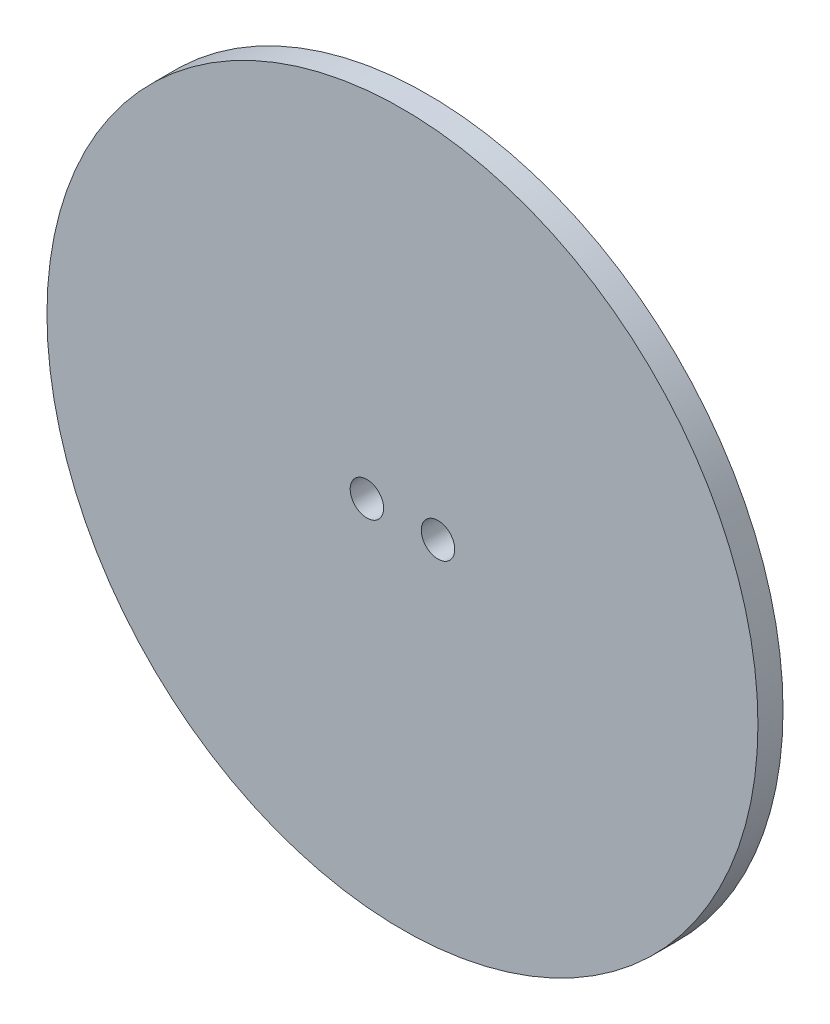
ISO-10303-21;
HEADER;
FILE_DESCRIPTION(('STEP AP214'),'2;1');
FILE_NAME('part.step','',(''),(''),'','','');
FILE_SCHEMA(('AUTOMOTIVE_DESIGN { 1 0 10303 214 1 1 1 1 }'));
ENDSEC;
DATA;
#1=APPLICATION_CONTEXT('core data for automotive mechanical design processes');
#2=APPLICATION_PROTOCOL_DEFINITION('international standard','automotive_design',2000,#1);
#3=PRODUCT_CONTEXT('',#1,'mechanical');
#4=PRODUCT('Part','Part','',(#3));
#5=PRODUCT_RELATED_PRODUCT_CATEGORY('part','',(#4));
#6=PRODUCT_DEFINITION_FORMATION('','',#4);
#7=PRODUCT_DEFINITION_CONTEXT('part definition',#1,'design');
#8=PRODUCT_DEFINITION('design','',#6,#7);
#9=PRODUCT_DEFINITION_SHAPE('','',#8);
#10=(LENGTH_UNIT() NAMED_UNIT(*) SI_UNIT(.MILLI.,.METRE.));
#11=(NAMED_UNIT(*) PLANE_ANGLE_UNIT() SI_UNIT($,.RADIAN.));
#12=(NAMED_UNIT(*) SI_UNIT($,.STERADIAN.) SOLID_ANGLE_UNIT());
#13=UNCERTAINTY_MEASURE_WITH_UNIT(LENGTH_MEASURE(1.E-05),#10,'distance_accuracy_value','');
#14=(GEOMETRIC_REPRESENTATION_CONTEXT(3) GLOBAL_UNCERTAINTY_ASSIGNED_CONTEXT((#13)) GLOBAL_UNIT_ASSIGNED_CONTEXT((#10,
#11,#12)) REPRESENTATION_CONTEXT('',''));
#15=CARTESIAN_POINT('',(0.,0.,0.));
#16=DIRECTION('',(0.,0.,1.));
#17=DIRECTION('',(1.,0.,0.));
#18=AXIS2_PLACEMENT_3D('',#15,#16,#17);
#19=CARTESIAN_POINT('',(0.,0.,3.));
#20=DIRECTION('',(0.,0.,-1.));
#21=DIRECTION('',(-1.,0.,0.));
#22=AXIS2_PLACEMENT_3D('',#19,#20,#21);
#23=CYLINDRICAL_SURFACE('',#22,42.5);
#24=CARTESIAN_POINT('',(0.,0.,3.));
#25=DIRECTION('',(0.,0.,1.));
#26=DIRECTION('',(1.,0.,0.));
#27=AXIS2_PLACEMENT_3D('',#24,#25,#26);
#28=CIRCLE('',#27,42.5);
#29=CARTESIAN_POINT('',(42.5,0.,3.));
#30=VERTEX_POINT('',#29);
#31=EDGE_CURVE('E10',#30,#30,#28,.T.);
#32=ORIENTED_EDGE('',*,*,#31,.F.);
#33=EDGE_LOOP('',(#32));
#34=FACE_BOUND('',#33,.T.);
#35=CARTESIAN_POINT('',(0.,0.,0.));
#36=DIRECTION('',(0.,0.,1.));
#37=DIRECTION('',(1.,0.,0.));
#38=AXIS2_PLACEMENT_3D('',#35,#36,#37);
#39=CIRCLE('',#38,42.5);
#40=CARTESIAN_POINT('',(42.5,0.,0.));
#41=VERTEX_POINT('',#40);
#42=EDGE_CURVE('E35',#41,#41,#39,.T.);
#43=ORIENTED_EDGE('',*,*,#42,.T.);
#44=EDGE_LOOP('',(#43));
#45=FACE_BOUND('',#44,.T.);
#46=ADVANCED_FACE('F32',(#34,#45),#23,.T.);
#47=CARTESIAN_POINT('',(0.,0.,3.));
#48=DIRECTION('',(0.,0.,1.));
#49=DIRECTION('',(1.,0.,0.));
#50=AXIS2_PLACEMENT_3D('',#47,#48,#49);
#51=PLANE('',#50);
#52=CARTESIAN_POINT('',(-4.25000000000001,0.,3.));
#53=DIRECTION('',(0.,0.,1.));
#54=DIRECTION('',(1.,0.,0.));
#55=AXIS2_PLACEMENT_3D('',#52,#53,#54);
#56=CIRCLE('',#55,2.);
#57=CARTESIAN_POINT('',(-6.25000000000001,0.,3.));
#58=VERTEX_POINT('',#57);
#59=EDGE_CURVE('E50',#58,#58,#56,.F.);
#60=ORIENTED_EDGE('',*,*,#59,.T.);
#61=EDGE_LOOP('',(#60));
#62=FACE_BOUND('',#61,.T.);
#63=CARTESIAN_POINT('',(4.24999999999999,0.,3.));
#64=DIRECTION('',(0.,0.,1.));
#65=DIRECTION('',(1.,0.,0.));
#66=AXIS2_PLACEMENT_3D('',#63,#64,#65);
#67=CIRCLE('',#66,2.);
#68=CARTESIAN_POINT('',(2.24999999999999,0.,3.));
#69=VERTEX_POINT('',#68);
#70=EDGE_CURVE('E44',#69,#69,#67,.F.);
#71=ORIENTED_EDGE('',*,*,#70,.T.);
#72=EDGE_LOOP('',(#71));
#73=FACE_BOUND('',#72,.T.);
#74=ORIENTED_EDGE('',*,*,#31,.T.);
#75=EDGE_LOOP('',(#74));
#76=FACE_BOUND('',#75,.T.);
#77=ADVANCED_FACE('F62',(#62,#73,#76),#51,.T.);
#78=CARTESIAN_POINT('',(0.,0.,0.));
#79=DIRECTION('',(0.,0.,1.));
#80=DIRECTION('',(1.,0.,0.));
#81=AXIS2_PLACEMENT_3D('',#78,#79,#80);
#82=PLANE('',#81);
#83=CARTESIAN_POINT('',(-4.25000000000001,0.,0.));
#84=DIRECTION('',(0.,0.,-1.));
#85=DIRECTION('',(-1.,0.,0.));
#86=AXIS2_PLACEMENT_3D('',#83,#84,#85);
#87=CIRCLE('',#86,2.);
#88=CARTESIAN_POINT('',(-6.25000000000001,0.,0.));
#89=VERTEX_POINT('',#88);
#90=EDGE_CURVE('E42',#89,#89,#87,.T.);
#91=ORIENTED_EDGE('',*,*,#90,.F.);
#92=EDGE_LOOP('',(#91));
#93=FACE_BOUND('',#92,.T.);
#94=CARTESIAN_POINT('',(4.24999999999999,0.,0.));
#95=DIRECTION('',(0.,0.,-1.));
#96=DIRECTION('',(-1.,0.,0.));
#97=AXIS2_PLACEMENT_3D('',#94,#95,#96);
#98=CIRCLE('',#97,2.);
#99=CARTESIAN_POINT('',(2.24999999999999,0.,0.));
#100=VERTEX_POINT('',#99);
#101=EDGE_CURVE('E47',#100,#100,#98,.T.);
#102=ORIENTED_EDGE('',*,*,#101,.F.);
#103=EDGE_LOOP('',(#102));
#104=FACE_BOUND('',#103,.T.);
#105=ORIENTED_EDGE('',*,*,#42,.F.);
#106=EDGE_LOOP('',(#105));
#107=FACE_BOUND('',#106,.T.);
#108=ADVANCED_FACE('F58',(#93,#104,#107),#82,.F.);
#109=CARTESIAN_POINT('',(4.24999999999999,0.,3.001));
#110=DIRECTION('',(0.,0.,-1.));
#111=DIRECTION('',(-1.,0.,0.));
#112=AXIS2_PLACEMENT_3D('',#109,#110,#111);
#113=CYLINDRICAL_SURFACE('',#112,2.);
#114=CARTESIAN_POINT('',(2.24999999999999,0.,3.));
#115=CARTESIAN_POINT('',(2.24999999999999,0.,2.96875));
#116=CARTESIAN_POINT('',(2.24999999999999,0.,2.9375));
#117=CARTESIAN_POINT('',(2.24999999999999,0.,2.875));
#118=CARTESIAN_POINT('',(2.24999999999999,0.,2.84375));
#119=CARTESIAN_POINT('',(2.24999999999999,0.,2.78125));
#120=CARTESIAN_POINT('',(2.24999999999999,0.,2.75));
#121=CARTESIAN_POINT('',(2.24999999999999,0.,2.6875));
#122=CARTESIAN_POINT('',(2.24999999999999,0.,2.65625));
#123=CARTESIAN_POINT('',(2.24999999999999,0.,2.59375));
#124=CARTESIAN_POINT('',(2.24999999999999,0.,2.5625));
#125=CARTESIAN_POINT('',(2.24999999999999,0.,2.5));
#126=CARTESIAN_POINT('',(2.24999999999999,0.,2.46875));
#127=CARTESIAN_POINT('',(2.24999999999999,0.,2.40625));
#128=CARTESIAN_POINT('',(2.24999999999999,0.,2.375));
#129=CARTESIAN_POINT('',(2.24999999999999,0.,2.3125));
#130=CARTESIAN_POINT('',(2.24999999999999,0.,2.28125));
#131=CARTESIAN_POINT('',(2.24999999999999,0.,2.21875));
#132=CARTESIAN_POINT('',(2.24999999999999,0.,2.1875));
#133=CARTESIAN_POINT('',(2.24999999999999,0.,2.125));
#134=CARTESIAN_POINT('',(2.24999999999999,0.,2.09375));
#135=CARTESIAN_POINT('',(2.24999999999999,0.,2.03125));
#136=CARTESIAN_POINT('',(2.24999999999999,0.,2.));
#137=CARTESIAN_POINT('',(2.24999999999999,0.,1.9375));
#138=CARTESIAN_POINT('',(2.24999999999999,0.,1.90625));
#139=CARTESIAN_POINT('',(2.24999999999999,0.,1.84375));
#140=CARTESIAN_POINT('',(2.24999999999999,0.,1.8125));
#141=CARTESIAN_POINT('',(2.24999999999999,0.,1.75));
#142=CARTESIAN_POINT('',(2.24999999999999,0.,1.71875));
#143=CARTESIAN_POINT('',(2.24999999999999,0.,1.65625));
#144=CARTESIAN_POINT('',(2.24999999999999,0.,1.625));
#145=CARTESIAN_POINT('',(2.24999999999999,0.,1.5625));
#146=CARTESIAN_POINT('',(2.24999999999999,0.,1.53125));
#147=CARTESIAN_POINT('',(2.24999999999999,0.,1.46875));
#148=CARTESIAN_POINT('',(2.24999999999999,0.,1.4375));
#149=CARTESIAN_POINT('',(2.24999999999999,0.,1.375));
#150=CARTESIAN_POINT('',(2.24999999999999,0.,1.34375));
#151=CARTESIAN_POINT('',(2.24999999999999,0.,1.28125));
#152=CARTESIAN_POINT('',(2.24999999999999,0.,1.25));
#153=CARTESIAN_POINT('',(2.24999999999999,0.,1.1875));
#154=CARTESIAN_POINT('',(2.24999999999999,0.,1.15625));
#155=CARTESIAN_POINT('',(2.24999999999999,0.,1.09375));
#156=CARTESIAN_POINT('',(2.24999999999999,0.,1.0625));
#157=CARTESIAN_POINT('',(2.24999999999999,0.,1.));
#158=CARTESIAN_POINT('',(2.24999999999999,0.,0.96875));
#159=CARTESIAN_POINT('',(2.24999999999999,0.,0.90625));
#160=CARTESIAN_POINT('',(2.24999999999999,0.,0.875));
#161=CARTESIAN_POINT('',(2.24999999999999,0.,0.8125));
#162=CARTESIAN_POINT('',(2.24999999999999,0.,0.78125));
#163=CARTESIAN_POINT('',(2.24999999999999,0.,0.71875));
#164=CARTESIAN_POINT('',(2.24999999999999,0.,0.6875));
#165=CARTESIAN_POINT('',(2.24999999999999,0.,0.625));
#166=CARTESIAN_POINT('',(2.24999999999999,0.,0.59375));
#167=CARTESIAN_POINT('',(2.24999999999999,0.,0.53125));
#168=CARTESIAN_POINT('',(2.24999999999999,0.,0.5));
#169=CARTESIAN_POINT('',(2.24999999999999,0.,0.4375));
#170=CARTESIAN_POINT('',(2.24999999999999,0.,0.40625));
#171=CARTESIAN_POINT('',(2.24999999999999,0.,0.34375));
#172=CARTESIAN_POINT('',(2.24999999999999,0.,0.3125));
#173=CARTESIAN_POINT('',(2.24999999999999,0.,0.25));
#174=CARTESIAN_POINT('',(2.24999999999999,0.,0.21875));
#175=CARTESIAN_POINT('',(2.24999999999999,0.,0.156250000000001));
#176=CARTESIAN_POINT('',(2.24999999999999,0.,0.125000000000001));
#177=CARTESIAN_POINT('',(2.24999999999999,0.,0.0625000000000005));
#178=CARTESIAN_POINT('',(2.24999999999999,0.,0.0312500000000005));
#179=CARTESIAN_POINT('',(2.24999999999999,0.,0.));
#180=B_SPLINE_CURVE_WITH_KNOTS('',3,(#114,#115,#116,#117,#118,#119,#120,#121,#122,#123,#124,
#125,#126,#127,#128,#129,#130,#131,#132,#133,#134,#135,#136,#137,#138,#139,#140,#141,#142,#143,
#144,#145,#146,#147,#148,#149,#150,#151,#152,#153,#154,#155,#156,#157,#158,#159,#160,#161,#162,
#163,#164,#165,#166,#167,#168,#169,#170,#171,#172,#173,#174,#175,#176,#177,#178,#179),
.UNSPECIFIED.,.F.,.F.,(4,2,2,2,2,2,2,2,2,2,2,2,2,2,2,2,2,2,2,2,2,2,2,2,2,2,2,2,2,2,2,2,4),(0.,
0.0937499999999997,0.1875,0.28125,0.375,0.46875,0.5625,0.65625,0.749999999999999,
0.843749999999999,0.9375,1.03125,1.125,1.21875,1.3125,1.40625,1.5,1.59375,1.6875,1.78125,1.875,
1.96875,2.0625,2.15625,2.25,2.34375,2.4375,2.53125,2.625,2.71875,2.8125,2.90625,3.),.UNSPECIFIED.);
#181=EDGE_CURVE('BSEAM61',#69,#100,#180,.T.);
#182=ORIENTED_EDGE('',*,*,#70,.F.);
#183=ORIENTED_EDGE('',*,*,#101,.T.);
#184=ORIENTED_EDGE('',*,*,#181,.T.);
#185=ORIENTED_EDGE('',*,*,#181,.F.);
#186=EDGE_LOOP('',(#182,#184,#183,#185));
#187=FACE_BOUND('',#186,.T.);
#188=ADVANCED_FACE('F61',(#187),#113,.F.);
#189=CARTESIAN_POINT('',(-4.25000000000001,0.,3.001));
#190=DIRECTION('',(0.,0.,-1.));
#191=DIRECTION('',(-1.,0.,0.));
#192=AXIS2_PLACEMENT_3D('',#189,#190,#191);
#193=CYLINDRICAL_SURFACE('',#192,2.);
#194=CARTESIAN_POINT('',(-6.25000000000001,0.,3.));
#195=CARTESIAN_POINT('',(-6.25000000000001,0.,2.96875));
#196=CARTESIAN_POINT('',(-6.25000000000001,0.,2.9375));
#197=CARTESIAN_POINT('',(-6.25000000000001,0.,2.875));
#198=CARTESIAN_POINT('',(-6.25000000000001,0.,2.84375));
#199=CARTESIAN_POINT('',(-6.25000000000001,0.,2.78125));
#200=CARTESIAN_POINT('',(-6.25000000000001,0.,2.75));
#201=CARTESIAN_POINT('',(-6.25000000000001,0.,2.6875));
#202=CARTESIAN_POINT('',(-6.25000000000001,0.,2.65625));
#203=CARTESIAN_POINT('',(-6.25000000000001,0.,2.59375));
#204=CARTESIAN_POINT('',(-6.25000000000001,0.,2.5625));
#205=CARTESIAN_POINT('',(-6.25000000000001,0.,2.5));
#206=CARTESIAN_POINT('',(-6.25000000000001,0.,2.46875));
#207=CARTESIAN_POINT('',(-6.25000000000001,0.,2.40625));
#208=CARTESIAN_POINT('',(-6.25000000000001,0.,2.375));
#209=CARTESIAN_POINT('',(-6.25000000000001,0.,2.3125));
#210=CARTESIAN_POINT('',(-6.25000000000001,0.,2.28125));
#211=CARTESIAN_POINT('',(-6.25000000000001,0.,2.21875));
#212=CARTESIAN_POINT('',(-6.25000000000001,0.,2.1875));
#213=CARTESIAN_POINT('',(-6.25000000000001,0.,2.125));
#214=CARTESIAN_POINT('',(-6.25000000000001,0.,2.09375));
#215=CARTESIAN_POINT('',(-6.25000000000001,0.,2.03125));
#216=CARTESIAN_POINT('',(-6.25000000000001,0.,2.));
#217=CARTESIAN_POINT('',(-6.25000000000001,0.,1.9375));
#218=CARTESIAN_POINT('',(-6.25000000000001,0.,1.90625));
#219=CARTESIAN_POINT('',(-6.25000000000001,0.,1.84375));
#220=CARTESIAN_POINT('',(-6.25000000000001,0.,1.8125));
#221=CARTESIAN_POINT('',(-6.25000000000001,0.,1.75));
#222=CARTESIAN_POINT('',(-6.25000000000001,0.,1.71875));
#223=CARTESIAN_POINT('',(-6.25000000000001,0.,1.65625));
#224=CARTESIAN_POINT('',(-6.25000000000001,0.,1.625));
#225=CARTESIAN_POINT('',(-6.25000000000001,0.,1.5625));
#226=CARTESIAN_POINT('',(-6.25000000000001,0.,1.53125));
#227=CARTESIAN_POINT('',(-6.25000000000001,0.,1.46875));
#228=CARTESIAN_POINT('',(-6.25000000000001,0.,1.4375));
#229=CARTESIAN_POINT('',(-6.25000000000001,0.,1.375));
#230=CARTESIAN_POINT('',(-6.25000000000001,0.,1.34375));
#231=CARTESIAN_POINT('',(-6.25000000000001,0.,1.28125));
#232=CARTESIAN_POINT('',(-6.25000000000001,0.,1.25));
#233=CARTESIAN_POINT('',(-6.25000000000001,0.,1.1875));
#234=CARTESIAN_POINT('',(-6.25000000000001,0.,1.15625));
#235=CARTESIAN_POINT('',(-6.25000000000001,0.,1.09375));
#236=CARTESIAN_POINT('',(-6.25000000000001,0.,1.0625));
#237=CARTESIAN_POINT('',(-6.25000000000001,0.,1.));
#238=CARTESIAN_POINT('',(-6.25000000000001,0.,0.96875));
#239=CARTESIAN_POINT('',(-6.25000000000001,0.,0.90625));
#240=CARTESIAN_POINT('',(-6.25000000000001,0.,0.875));
#241=CARTESIAN_POINT('',(-6.25000000000001,0.,0.8125));
#242=CARTESIAN_POINT('',(-6.25000000000001,0.,0.78125));
#243=CARTESIAN_POINT('',(-6.25000000000001,0.,0.71875));
#244=CARTESIAN_POINT('',(-6.25000000000001,0.,0.6875));
#245=CARTESIAN_POINT('',(-6.25000000000001,0.,0.625));
#246=CARTESIAN_POINT('',(-6.25000000000001,0.,0.59375));
#247=CARTESIAN_POINT('',(-6.25000000000001,0.,0.53125));
#248=CARTESIAN_POINT('',(-6.25000000000001,0.,0.5));
#249=CARTESIAN_POINT('',(-6.25000000000001,0.,0.4375));
#250=CARTESIAN_POINT('',(-6.25000000000001,0.,0.40625));
#251=CARTESIAN_POINT('',(-6.25000000000001,0.,0.34375));
#252=CARTESIAN_POINT('',(-6.25000000000001,0.,0.3125));
#253=CARTESIAN_POINT('',(-6.25000000000001,0.,0.25));
#254=CARTESIAN_POINT('',(-6.25000000000001,0.,0.21875));
#255=CARTESIAN_POINT('',(-6.25000000000001,0.,0.156250000000001));
#256=CARTESIAN_POINT('',(-6.25000000000001,0.,0.125000000000001));
#257=CARTESIAN_POINT('',(-6.25000000000001,0.,0.0625000000000005));
#258=CARTESIAN_POINT('',(-6.25000000000001,0.,0.0312500000000005));
#259=CARTESIAN_POINT('',(-6.25000000000001,0.,0.));
#260=B_SPLINE_CURVE_WITH_KNOTS('',3,(#194,#195,#196,#197,#198,#199,#200,#201,#202,#203,#204,
#205,#206,#207,#208,#209,#210,#211,#212,#213,#214,#215,#216,#217,#218,#219,#220,#221,#222,#223,
#224,#225,#226,#227,#228,#229,#230,#231,#232,#233,#234,#235,#236,#237,#238,#239,#240,#241,#242,
#243,#244,#245,#246,#247,#248,#249,#250,#251,#252,#253,#254,#255,#256,#257,#258,#259),
.UNSPECIFIED.,.F.,.F.,(4,2,2,2,2,2,2,2,2,2,2,2,2,2,2,2,2,2,2,2,2,2,2,2,2,2,2,2,2,2,2,2,4),(0.,
0.0937499999999997,0.1875,0.28125,0.375,0.46875,0.5625,0.65625,0.749999999999999,
0.843749999999999,0.9375,1.03125,1.125,1.21875,1.3125,1.40625,1.5,1.59375,1.6875,1.78125,1.875,
1.96875,2.0625,2.15625,2.25,2.34375,2.4375,2.53125,2.625,2.71875,2.8125,2.90625,3.),.UNSPECIFIED.);
#261=EDGE_CURVE('BSEAM56',#58,#89,#260,.T.);
#262=ORIENTED_EDGE('',*,*,#59,.F.);
#263=ORIENTED_EDGE('',*,*,#90,.T.);
#264=ORIENTED_EDGE('',*,*,#261,.T.);
#265=ORIENTED_EDGE('',*,*,#261,.F.);
#266=EDGE_LOOP('',(#262,#264,#263,#265));
#267=FACE_BOUND('',#266,.T.);
#268=ADVANCED_FACE('F56',(#267),#193,.F.);
#269=CLOSED_SHELL('',(#46,#77,#108,#188,#268));
#270=MANIFOLD_SOLID_BREP('B2',#269);
#271=ADVANCED_BREP_SHAPE_REPRESENTATION('',(#18,#270),#14);
#272=SHAPE_DEFINITION_REPRESENTATION(#9,#271);
ENDSEC;
END-ISO-10303-21;
